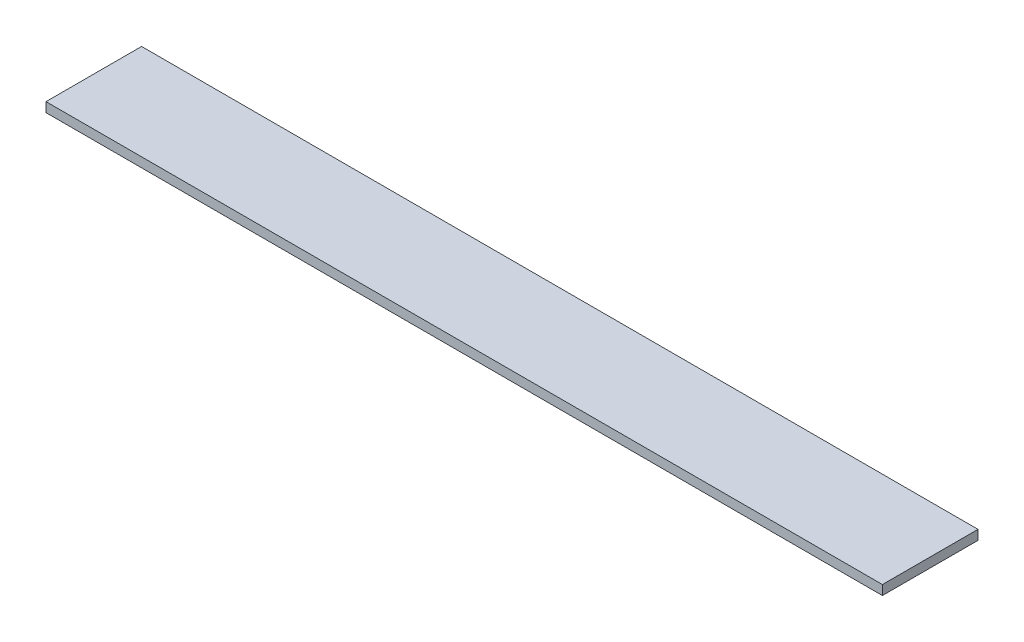
ISO-10303-21;
HEADER;
FILE_DESCRIPTION(('STEP AP214'),'2;1');
FILE_NAME('part.step','',(''),(''),'','','');
FILE_SCHEMA(('AUTOMOTIVE_DESIGN { 1 0 10303 214 1 1 1 1 }'));
ENDSEC;
DATA;
#1=APPLICATION_CONTEXT('core data for automotive mechanical design processes');
#2=APPLICATION_PROTOCOL_DEFINITION('international standard','automotive_design',2000,#1);
#3=PRODUCT_CONTEXT('',#1,'mechanical');
#4=PRODUCT('Part','Part','',(#3));
#5=PRODUCT_RELATED_PRODUCT_CATEGORY('part','',(#4));
#6=PRODUCT_DEFINITION_FORMATION('','',#4);
#7=PRODUCT_DEFINITION_CONTEXT('part definition',#1,'design');
#8=PRODUCT_DEFINITION('design','',#6,#7);
#9=PRODUCT_DEFINITION_SHAPE('','',#8);
#10=(LENGTH_UNIT() NAMED_UNIT(*) SI_UNIT(.MILLI.,.METRE.));
#11=(NAMED_UNIT(*) PLANE_ANGLE_UNIT() SI_UNIT($,.RADIAN.));
#12=(NAMED_UNIT(*) SI_UNIT($,.STERADIAN.) SOLID_ANGLE_UNIT());
#13=UNCERTAINTY_MEASURE_WITH_UNIT(LENGTH_MEASURE(1.E-05),#10,'distance_accuracy_value','');
#14=(GEOMETRIC_REPRESENTATION_CONTEXT(3) GLOBAL_UNCERTAINTY_ASSIGNED_CONTEXT((#13)) GLOBAL_UNIT_ASSIGNED_CONTEXT((#10,
#11,#12)) REPRESENTATION_CONTEXT('',''));
#15=CARTESIAN_POINT('',(0.,0.,0.));
#16=DIRECTION('',(0.,0.,1.));
#17=DIRECTION('',(1.,0.,0.));
#18=AXIS2_PLACEMENT_3D('',#15,#16,#17);
#19=CARTESIAN_POINT('',(0.,4.,0.));
#20=DIRECTION('',(1.,0.,0.));
#21=DIRECTION('',(0.,0.,-1.));
#22=AXIS2_PLACEMENT_3D('',#19,#20,#21);
#23=PLANE('',#22);
#24=DIRECTION('',(0.,0.,1.));
#25=VECTOR('',#24,1.);
#26=CARTESIAN_POINT('',(0.,0.,0.));
#27=LINE('',#26,#25);
#28=CARTESIAN_POINT('',(0.,0.,-40.));
#29=VERTEX_POINT('',#28);
#30=CARTESIAN_POINT('',(0.,0.,0.));
#31=VERTEX_POINT('',#30);
#32=EDGE_CURVE('E107',#29,#31,#27,.T.);
#33=ORIENTED_EDGE('',*,*,#32,.T.);
#34=DIRECTION('',(0.,-1.,0.));
#35=VECTOR('',#34,1.);
#36=CARTESIAN_POINT('',(0.,4.,0.));
#37=LINE('',#36,#35);
#38=CARTESIAN_POINT('',(0.,4.,0.));
#39=VERTEX_POINT('',#38);
#40=EDGE_CURVE('E11',#39,#31,#37,.T.);
#41=ORIENTED_EDGE('',*,*,#40,.F.);
#42=DIRECTION('',(0.,0.,1.));
#43=VECTOR('',#42,1.);
#44=CARTESIAN_POINT('',(0.,4.,0.));
#45=LINE('',#44,#43);
#46=CARTESIAN_POINT('',(0.,4.,-40.));
#47=VERTEX_POINT('',#46);
#48=EDGE_CURVE('E91',#47,#39,#45,.T.);
#49=ORIENTED_EDGE('',*,*,#48,.F.);
#50=DIRECTION('',(0.,-1.,0.));
#51=VECTOR('',#50,1.);
#52=CARTESIAN_POINT('',(0.,4.,-40.));
#53=LINE('',#52,#51);
#54=EDGE_CURVE('E103',#47,#29,#53,.T.);
#55=ORIENTED_EDGE('',*,*,#54,.T.);
#56=EDGE_LOOP('',(#33,#41,#49,#55));
#57=FACE_BOUND('',#56,.T.);
#58=ADVANCED_FACE('F39',(#57),#23,.F.);
#59=CARTESIAN_POINT('',(0.,4.,0.));
#60=DIRECTION('',(0.,0.,-1.));
#61=DIRECTION('',(-1.,0.,0.));
#62=AXIS2_PLACEMENT_3D('',#59,#60,#61);
#63=PLANE('',#62);
#64=DIRECTION('',(1.,0.,0.));
#65=VECTOR('',#64,1.);
#66=CARTESIAN_POINT('',(0.,0.,0.));
#67=LINE('',#66,#65);
#68=CARTESIAN_POINT('',(350.,0.,0.));
#69=VERTEX_POINT('',#68);
#70=EDGE_CURVE('E96',#31,#69,#67,.T.);
#71=ORIENTED_EDGE('',*,*,#70,.T.);
#72=DIRECTION('',(0.,-1.,0.));
#73=VECTOR('',#72,1.);
#74=CARTESIAN_POINT('',(350.,4.,0.));
#75=LINE('',#74,#73);
#76=CARTESIAN_POINT('',(350.,4.,0.));
#77=VERTEX_POINT('',#76);
#78=EDGE_CURVE('E48',#77,#69,#75,.T.);
#79=ORIENTED_EDGE('',*,*,#78,.F.);
#80=DIRECTION('',(1.,0.,0.));
#81=VECTOR('',#80,1.);
#82=CARTESIAN_POINT('',(0.,4.,0.));
#83=LINE('',#82,#81);
#84=EDGE_CURVE('E86',#39,#77,#83,.T.);
#85=ORIENTED_EDGE('',*,*,#84,.F.);
#86=ORIENTED_EDGE('',*,*,#40,.T.);
#87=EDGE_LOOP('',(#71,#79,#85,#86));
#88=FACE_BOUND('',#87,.T.);
#89=ADVANCED_FACE('F95',(#88),#63,.F.);
#90=CARTESIAN_POINT('',(350.,4.,0.));
#91=DIRECTION('',(-1.,0.,0.));
#92=DIRECTION('',(0.,0.,1.));
#93=AXIS2_PLACEMENT_3D('',#90,#91,#92);
#94=PLANE('',#93);
#95=DIRECTION('',(0.,0.,-1.));
#96=VECTOR('',#95,1.);
#97=CARTESIAN_POINT('',(350.,0.,0.));
#98=LINE('',#97,#96);
#99=CARTESIAN_POINT('',(350.,0.,-40.));
#100=VERTEX_POINT('',#99);
#101=EDGE_CURVE('E73',#69,#100,#98,.T.);
#102=ORIENTED_EDGE('',*,*,#101,.T.);
#103=DIRECTION('',(0.,-1.,0.));
#104=VECTOR('',#103,1.);
#105=CARTESIAN_POINT('',(350.,4.,-40.));
#106=LINE('',#105,#104);
#107=CARTESIAN_POINT('',(350.,4.,-40.));
#108=VERTEX_POINT('',#107);
#109=EDGE_CURVE('E98',#108,#100,#106,.T.);
#110=ORIENTED_EDGE('',*,*,#109,.F.);
#111=DIRECTION('',(0.,0.,-1.));
#112=VECTOR('',#111,1.);
#113=CARTESIAN_POINT('',(350.,4.,0.));
#114=LINE('',#113,#112);
#115=EDGE_CURVE('E89',#77,#108,#114,.T.);
#116=ORIENTED_EDGE('',*,*,#115,.F.);
#117=ORIENTED_EDGE('',*,*,#78,.T.);
#118=EDGE_LOOP('',(#102,#110,#116,#117));
#119=FACE_BOUND('',#118,.T.);
#120=ADVANCED_FACE('F99',(#119),#94,.F.);
#121=CARTESIAN_POINT('',(0.,4.,-40.));
#122=DIRECTION('',(0.,0.,1.));
#123=DIRECTION('',(1.,0.,0.));
#124=AXIS2_PLACEMENT_3D('',#121,#122,#123);
#125=PLANE('',#124);
#126=DIRECTION('',(-1.,0.,0.));
#127=VECTOR('',#126,1.);
#128=CARTESIAN_POINT('',(0.,0.,-40.));
#129=LINE('',#128,#127);
#130=EDGE_CURVE('E79',#100,#29,#129,.T.);
#131=ORIENTED_EDGE('',*,*,#130,.T.);
#132=ORIENTED_EDGE('',*,*,#54,.F.);
#133=DIRECTION('',(-1.,0.,0.));
#134=VECTOR('',#133,1.);
#135=CARTESIAN_POINT('',(0.,4.,-40.));
#136=LINE('',#135,#134);
#137=EDGE_CURVE('E56',#108,#47,#136,.T.);
#138=ORIENTED_EDGE('',*,*,#137,.F.);
#139=ORIENTED_EDGE('',*,*,#109,.T.);
#140=EDGE_LOOP('',(#131,#132,#138,#139));
#141=FACE_BOUND('',#140,.T.);
#142=ADVANCED_FACE('F120',(#141),#125,.F.);
#143=CARTESIAN_POINT('',(0.,4.,0.));
#144=DIRECTION('',(0.,-1.,0.));
#145=DIRECTION('',(0.,0.,-1.));
#146=AXIS2_PLACEMENT_3D('',#143,#144,#145);
#147=PLANE('',#146);
#148=ORIENTED_EDGE('',*,*,#48,.T.);
#149=ORIENTED_EDGE('',*,*,#84,.T.);
#150=ORIENTED_EDGE('',*,*,#115,.T.);
#151=ORIENTED_EDGE('',*,*,#137,.T.);
#152=EDGE_LOOP('',(#148,#149,#150,#151));
#153=FACE_BOUND('',#152,.T.);
#154=ADVANCED_FACE('F87',(#153),#147,.F.);
#155=CARTESIAN_POINT('',(0.,0.,0.));
#156=DIRECTION('',(0.,-1.,0.));
#157=DIRECTION('',(0.,0.,-1.));
#158=AXIS2_PLACEMENT_3D('',#155,#156,#157);
#159=PLANE('',#158);
#160=ORIENTED_EDGE('',*,*,#32,.F.);
#161=ORIENTED_EDGE('',*,*,#130,.F.);
#162=ORIENTED_EDGE('',*,*,#101,.F.);
#163=ORIENTED_EDGE('',*,*,#70,.F.);
#164=EDGE_LOOP('',(#160,#161,#162,#163));
#165=FACE_BOUND('',#164,.T.);
#166=ADVANCED_FACE('F123',(#165),#159,.T.);
#167=CLOSED_SHELL('',(#58,#89,#120,#142,#154,#166));
#168=MANIFOLD_SOLID_BREP('B2',#167);
#169=ADVANCED_BREP_SHAPE_REPRESENTATION('',(#18,#168),#14);
#170=SHAPE_DEFINITION_REPRESENTATION(#9,#169);
ENDSEC;
END-ISO-10303-21;
